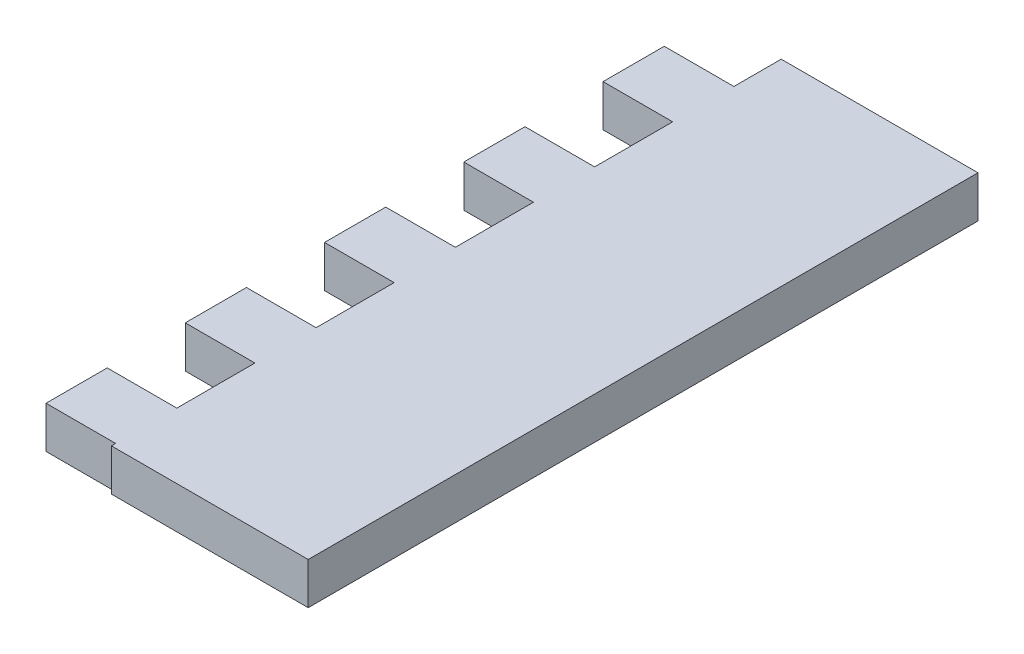
ISO-10303-21;
HEADER;
FILE_DESCRIPTION(('STEP AP214'),'2;1');
FILE_NAME('part.step','',(''),(''),'','','');
FILE_SCHEMA(('AUTOMOTIVE_DESIGN { 1 0 10303 214 1 1 1 1 }'));
ENDSEC;
DATA;
#1=APPLICATION_CONTEXT('core data for automotive mechanical design processes');
#2=APPLICATION_PROTOCOL_DEFINITION('international standard','automotive_design',2000,#1);
#3=PRODUCT_CONTEXT('',#1,'mechanical');
#4=PRODUCT('Part','Part','',(#3));
#5=PRODUCT_RELATED_PRODUCT_CATEGORY('part','',(#4));
#6=PRODUCT_DEFINITION_FORMATION('','',#4);
#7=PRODUCT_DEFINITION_CONTEXT('part definition',#1,'design');
#8=PRODUCT_DEFINITION('design','',#6,#7);
#9=PRODUCT_DEFINITION_SHAPE('','',#8);
#10=(LENGTH_UNIT() NAMED_UNIT(*) SI_UNIT(.MILLI.,.METRE.));
#11=(NAMED_UNIT(*) PLANE_ANGLE_UNIT() SI_UNIT($,.RADIAN.));
#12=(NAMED_UNIT(*) SI_UNIT($,.STERADIAN.) SOLID_ANGLE_UNIT());
#13=UNCERTAINTY_MEASURE_WITH_UNIT(LENGTH_MEASURE(1.E-05),#10,'distance_accuracy_value','');
#14=(GEOMETRIC_REPRESENTATION_CONTEXT(3) GLOBAL_UNCERTAINTY_ASSIGNED_CONTEXT((#13)) GLOBAL_UNIT_ASSIGNED_CONTEXT((#10,
#11,#12)) REPRESENTATION_CONTEXT('',''));
#15=CARTESIAN_POINT('',(0.,0.,0.));
#16=DIRECTION('',(0.,0.,1.));
#17=DIRECTION('',(1.,0.,0.));
#18=AXIS2_PLACEMENT_3D('',#15,#16,#17);
#19=CARTESIAN_POINT('',(-9.56520415000191,3.,-25.));
#20=DIRECTION('',(1.,0.,0.));
#21=DIRECTION('',(0.,0.,-1.));
#22=AXIS2_PLACEMENT_3D('',#19,#20,#21);
#23=PLANE('',#22);
#24=DIRECTION('',(0.,0.,1.));
#25=VECTOR('',#24,1.);
#26=CARTESIAN_POINT('',(-9.56520415000191,0.,-25.));
#27=LINE('',#26,#25);
#28=CARTESIAN_POINT('',(-9.56520415000191,0.,-19.6973042257871));
#29=VERTEX_POINT('',#28);
#30=CARTESIAN_POINT('',(-9.56520415000191,0.,-15.302695774213));
#31=VERTEX_POINT('',#30);
#32=EDGE_CURVE('E333',#29,#31,#27,.T.);
#33=ORIENTED_EDGE('',*,*,#32,.T.);
#34=DIRECTION('',(0.,1.,0.));
#35=VECTOR('',#34,1.);
#36=CARTESIAN_POINT('',(-9.56520415000191,-7.,-15.302695774213));
#37=LINE('',#36,#35);
#38=CARTESIAN_POINT('',(-9.56520415000191,3.,-15.302695774213));
#39=VERTEX_POINT('',#38);
#40=EDGE_CURVE('E215',#31,#39,#37,.T.);
#41=ORIENTED_EDGE('',*,*,#40,.T.);
#42=DIRECTION('',(0.,0.,1.));
#43=VECTOR('',#42,1.);
#44=CARTESIAN_POINT('',(-9.56520415000191,3.,-25.));
#45=LINE('',#44,#43);
#46=CARTESIAN_POINT('',(-9.56520415000191,3.,-19.6973042257871));
#47=VERTEX_POINT('',#46);
#48=EDGE_CURVE('E221',#47,#39,#45,.T.);
#49=ORIENTED_EDGE('',*,*,#48,.F.);
#50=DIRECTION('',(0.,1.,0.));
#51=VECTOR('',#50,1.);
#52=CARTESIAN_POINT('',(-9.56520415000191,-7.,-19.6973042257871));
#53=LINE('',#52,#51);
#54=EDGE_CURVE('E292',#29,#47,#53,.T.);
#55=ORIENTED_EDGE('',*,*,#54,.F.);
#56=EDGE_LOOP('',(#33,#41,#49,#55));
#57=FACE_BOUND('',#56,.T.);
#58=ADVANCED_FACE('F35',(#57),#23,.F.);
#59=CARTESIAN_POINT('',(-9.56520415000191,3.,-9.69730422578705));
#60=VERTEX_POINT('',#59);
#61=CARTESIAN_POINT('',(-9.56520415000191,3.,-5.30269577421296));
#62=VERTEX_POINT('',#61);
#63=EDGE_CURVE('E327',#60,#62,#45,.T.);
#64=ORIENTED_EDGE('',*,*,#63,.F.);
#65=DIRECTION('',(0.,1.,0.));
#66=VECTOR('',#65,1.);
#67=CARTESIAN_POINT('',(-9.56520415000191,-7.,-9.69730422578705));
#68=LINE('',#67,#66);
#69=CARTESIAN_POINT('',(-9.56520415000191,0.,-9.69730422578705));
#70=VERTEX_POINT('',#69);
#71=EDGE_CURVE('E223',#70,#60,#68,.T.);
#72=ORIENTED_EDGE('',*,*,#71,.F.);
#73=CARTESIAN_POINT('',(-9.56520415000191,0.,-5.30269577421296));
#74=VERTEX_POINT('',#73);
#75=EDGE_CURVE('E336',#70,#74,#27,.T.);
#76=ORIENTED_EDGE('',*,*,#75,.T.);
#77=DIRECTION('',(0.,1.,0.));
#78=VECTOR('',#77,1.);
#79=CARTESIAN_POINT('',(-9.56520415000191,-7.,-5.30269577421296));
#80=LINE('',#79,#78);
#81=EDGE_CURVE('E234',#74,#62,#80,.T.);
#82=ORIENTED_EDGE('',*,*,#81,.T.);
#83=EDGE_LOOP('',(#64,#72,#76,#82));
#84=FACE_BOUND('',#83,.T.);
#85=ADVANCED_FACE('F377',(#84),#23,.F.);
#86=CARTESIAN_POINT('',(-9.56520415000191,3.,0.302695774212949));
#87=VERTEX_POINT('',#86);
#88=CARTESIAN_POINT('',(-9.56520415000191,3.,4.69730422578704));
#89=VERTEX_POINT('',#88);
#90=EDGE_CURVE('E380',#87,#89,#45,.T.);
#91=ORIENTED_EDGE('',*,*,#90,.F.);
#92=DIRECTION('',(0.,1.,0.));
#93=VECTOR('',#92,1.);
#94=CARTESIAN_POINT('',(-9.56520415000191,-7.,0.302695774212949));
#95=LINE('',#94,#93);
#96=CARTESIAN_POINT('',(-9.56520415000191,0.,0.302695774212949));
#97=VERTEX_POINT('',#96);
#98=EDGE_CURVE('E243',#97,#87,#95,.T.);
#99=ORIENTED_EDGE('',*,*,#98,.F.);
#100=CARTESIAN_POINT('',(-9.56520415000191,0.,4.69730422578704));
#101=VERTEX_POINT('',#100);
#102=EDGE_CURVE('E680',#97,#101,#27,.T.);
#103=ORIENTED_EDGE('',*,*,#102,.T.);
#104=DIRECTION('',(0.,1.,0.));
#105=VECTOR('',#104,1.);
#106=CARTESIAN_POINT('',(-9.56520415000191,-7.,4.69730422578704));
#107=LINE('',#106,#105);
#108=EDGE_CURVE('E250',#101,#89,#107,.T.);
#109=ORIENTED_EDGE('',*,*,#108,.T.);
#110=EDGE_LOOP('',(#91,#99,#103,#109));
#111=FACE_BOUND('',#110,.T.);
#112=ADVANCED_FACE('F436',(#111),#23,.F.);
#113=CARTESIAN_POINT('',(-9.56520415000191,3.,10.3026957742129));
#114=VERTEX_POINT('',#113);
#115=CARTESIAN_POINT('',(-9.56520415000191,3.,14.697304225787));
#116=VERTEX_POINT('',#115);
#117=EDGE_CURVE('E382',#114,#116,#45,.T.);
#118=ORIENTED_EDGE('',*,*,#117,.F.);
#119=DIRECTION('',(0.,1.,0.));
#120=VECTOR('',#119,1.);
#121=CARTESIAN_POINT('',(-9.56520415000191,-7.,10.3026957742129));
#122=LINE('',#121,#120);
#123=CARTESIAN_POINT('',(-9.56520415000191,0.,10.3026957742129));
#124=VERTEX_POINT('',#123);
#125=EDGE_CURVE('E259',#124,#114,#122,.T.);
#126=ORIENTED_EDGE('',*,*,#125,.F.);
#127=CARTESIAN_POINT('',(-9.56520415000191,0.,14.697304225787));
#128=VERTEX_POINT('',#127);
#129=EDGE_CURVE('E453',#124,#128,#27,.T.);
#130=ORIENTED_EDGE('',*,*,#129,.T.);
#131=DIRECTION('',(0.,1.,0.));
#132=VECTOR('',#131,1.);
#133=CARTESIAN_POINT('',(-9.56520415000191,-7.,14.697304225787));
#134=LINE('',#133,#132);
#135=EDGE_CURVE('E266',#128,#116,#134,.T.);
#136=ORIENTED_EDGE('',*,*,#135,.T.);
#137=EDGE_LOOP('',(#118,#126,#130,#136));
#138=FACE_BOUND('',#137,.T.);
#139=ADVANCED_FACE('F439',(#138),#23,.F.);
#140=CARTESIAN_POINT('',(9.56520415000191,3.,-25.));
#141=DIRECTION('',(-1.,0.,0.));
#142=DIRECTION('',(0.,0.,1.));
#143=AXIS2_PLACEMENT_3D('',#140,#141,#142);
#144=PLANE('',#143);
#145=DIRECTION('',(0.,0.,-1.));
#146=VECTOR('',#145,1.);
#147=CARTESIAN_POINT('',(9.56520415000191,0.,-25.));
#148=LINE('',#147,#146);
#149=CARTESIAN_POINT('',(9.56520415000191,0.,25.));
#150=VERTEX_POINT('',#149);
#151=CARTESIAN_POINT('',(9.56520415000191,0.,-23.0948619852018));
#152=VERTEX_POINT('',#151);
#153=EDGE_CURVE('E318',#150,#152,#148,.T.);
#154=ORIENTED_EDGE('',*,*,#153,.T.);
#155=DIRECTION('',(0.,1.,0.));
#156=VECTOR('',#155,1.);
#157=CARTESIAN_POINT('',(9.56520415000191,3.,-23.0948619852018));
#158=LINE('',#157,#156);
#159=CARTESIAN_POINT('',(9.56520415000191,3.,-23.0948619852018));
#160=VERTEX_POINT('',#159);
#161=EDGE_CURVE('E300',#152,#160,#158,.T.);
#162=ORIENTED_EDGE('',*,*,#161,.T.);
#163=DIRECTION('',(0.,0.,-1.));
#164=VECTOR('',#163,1.);
#165=CARTESIAN_POINT('',(9.56520415000191,3.,-25.));
#166=LINE('',#165,#164);
#167=CARTESIAN_POINT('',(9.56520415000191,3.,25.));
#168=VERTEX_POINT('',#167);
#169=EDGE_CURVE('E320',#168,#160,#166,.T.);
#170=ORIENTED_EDGE('',*,*,#169,.F.);
#171=DIRECTION('',(0.,-1.,0.));
#172=VECTOR('',#171,1.);
#173=CARTESIAN_POINT('',(9.56520415000191,3.,25.));
#174=LINE('',#173,#172);
#175=EDGE_CURVE('E329',#168,#150,#174,.T.);
#176=ORIENTED_EDGE('',*,*,#175,.T.);
#177=EDGE_LOOP('',(#154,#162,#170,#176));
#178=FACE_BOUND('',#177,.T.);
#179=ADVANCED_FACE('F37',(#178),#144,.F.);
#180=CARTESIAN_POINT('',(-9.5652041500019,3.,20.3026957742129));
#181=VERTEX_POINT('',#180);
#182=CARTESIAN_POINT('',(-9.5652041500019,3.,24.697304225787));
#183=VERTEX_POINT('',#182);
#184=EDGE_CURVE('E323',#181,#183,#45,.T.);
#185=ORIENTED_EDGE('',*,*,#184,.F.);
#186=DIRECTION('',(0.,1.,0.));
#187=VECTOR('',#186,1.);
#188=CARTESIAN_POINT('',(-9.5652041500019,-7.,20.3026957742129));
#189=LINE('',#188,#187);
#190=CARTESIAN_POINT('',(-9.5652041500019,0.,20.3026957742129));
#191=VERTEX_POINT('',#190);
#192=EDGE_CURVE('E275',#191,#181,#189,.T.);
#193=ORIENTED_EDGE('',*,*,#192,.F.);
#194=CARTESIAN_POINT('',(-9.5652041500019,0.,24.697304225787));
#195=VERTEX_POINT('',#194);
#196=EDGE_CURVE('E332',#191,#195,#27,.T.);
#197=ORIENTED_EDGE('',*,*,#196,.T.);
#198=DIRECTION('',(0.,1.,0.));
#199=VECTOR('',#198,1.);
#200=CARTESIAN_POINT('',(-9.5652041500019,-7.,24.697304225787));
#201=LINE('',#200,#199);
#202=EDGE_CURVE('E283',#195,#183,#201,.T.);
#203=ORIENTED_EDGE('',*,*,#202,.T.);
#204=EDGE_LOOP('',(#185,#193,#197,#203));
#205=FACE_BOUND('',#204,.T.);
#206=ADVANCED_FACE('F397',(#205),#23,.F.);
#207=CARTESIAN_POINT('',(-9.56520415000191,3.,25.));
#208=DIRECTION('',(0.,0.,-1.));
#209=DIRECTION('',(-1.,0.,0.));
#210=AXIS2_PLACEMENT_3D('',#207,#208,#209);
#211=PLANE('',#210);
#212=DIRECTION('',(1.,0.,0.));
#213=VECTOR('',#212,1.);
#214=CARTESIAN_POINT('',(-9.56520415000191,3.,25.));
#215=LINE('',#214,#213);
#216=CARTESIAN_POINT('',(-4.5652041500019,3.,25.));
#217=VERTEX_POINT('',#216);
#218=EDGE_CURVE('E326',#217,#168,#215,.T.);
#219=ORIENTED_EDGE('',*,*,#218,.F.);
#220=DIRECTION('',(0.,-1.,0.));
#221=VECTOR('',#220,1.);
#222=CARTESIAN_POINT('',(-4.5652041500019,3.,25.));
#223=LINE('',#222,#221);
#224=CARTESIAN_POINT('',(-4.5652041500019,0.,25.));
#225=VERTEX_POINT('',#224);
#226=EDGE_CURVE('E226',#217,#225,#223,.T.);
#227=ORIENTED_EDGE('',*,*,#226,.T.);
#228=DIRECTION('',(1.,0.,0.));
#229=VECTOR('',#228,1.);
#230=CARTESIAN_POINT('',(-9.56520415000191,0.,25.));
#231=LINE('',#230,#229);
#232=EDGE_CURVE('E324',#225,#150,#231,.T.);
#233=ORIENTED_EDGE('',*,*,#232,.T.);
#234=ORIENTED_EDGE('',*,*,#175,.F.);
#235=EDGE_LOOP('',(#219,#227,#233,#234));
#236=FACE_BOUND('',#235,.T.);
#237=ADVANCED_FACE('F407',(#236),#211,.F.);
#238=CARTESIAN_POINT('',(0.,3.,0.));
#239=DIRECTION('',(0.,1.,0.));
#240=DIRECTION('',(0.,0.,1.));
#241=AXIS2_PLACEMENT_3D('',#238,#239,#240);
#242=PLANE('',#241);
#243=DIRECTION('',(-1.,0.,0.));
#244=VECTOR('',#243,1.);
#245=CARTESIAN_POINT('',(-9.56520415000191,3.,-15.302695774213));
#246=LINE('',#245,#244);
#247=CARTESIAN_POINT('',(-4.56520415000191,3.,-15.302695774213));
#248=VERTEX_POINT('',#247);
#249=EDGE_CURVE('E213',#248,#39,#246,.T.);
#250=ORIENTED_EDGE('',*,*,#249,.F.);
#251=DIRECTION('',(0.,0.,-1.));
#252=VECTOR('',#251,1.);
#253=CARTESIAN_POINT('',(-4.56520415000191,3.,-15.));
#254=LINE('',#253,#252);
#255=CARTESIAN_POINT('',(-4.56520415000191,3.,-9.69730422578705));
#256=VERTEX_POINT('',#255);
#257=EDGE_CURVE('E197',#256,#248,#254,.T.);
#258=ORIENTED_EDGE('',*,*,#257,.F.);
#259=DIRECTION('',(1.,0.,0.));
#260=VECTOR('',#259,1.);
#261=CARTESIAN_POINT('',(-9.56520415000191,3.,-9.69730422578705));
#262=LINE('',#261,#260);
#263=EDGE_CURVE('E228',#60,#256,#262,.T.);
#264=ORIENTED_EDGE('',*,*,#263,.F.);
#265=ORIENTED_EDGE('',*,*,#63,.T.);
#266=DIRECTION('',(-1.,0.,0.));
#267=VECTOR('',#266,1.);
#268=CARTESIAN_POINT('',(-9.56520415000191,3.,-5.30269577421296));
#269=LINE('',#268,#267);
#270=CARTESIAN_POINT('',(-4.56520415000191,3.,-5.30269577421296));
#271=VERTEX_POINT('',#270);
#272=EDGE_CURVE('E232',#271,#62,#269,.T.);
#273=ORIENTED_EDGE('',*,*,#272,.F.);
#274=DIRECTION('',(0.,0.,-1.));
#275=VECTOR('',#274,1.);
#276=CARTESIAN_POINT('',(-4.56520415000191,3.,-5.));
#277=LINE('',#276,#275);
#278=CARTESIAN_POINT('',(-4.56520415000191,3.,0.302695774212949));
#279=VERTEX_POINT('',#278);
#280=EDGE_CURVE('E308',#279,#271,#277,.T.);
#281=ORIENTED_EDGE('',*,*,#280,.F.);
#282=DIRECTION('',(1.,0.,0.));
#283=VECTOR('',#282,1.);
#284=CARTESIAN_POINT('',(-9.56520415000191,3.,0.302695774212949));
#285=LINE('',#284,#283);
#286=EDGE_CURVE('E240',#87,#279,#285,.T.);
#287=ORIENTED_EDGE('',*,*,#286,.F.);
#288=ORIENTED_EDGE('',*,*,#90,.T.);
#289=DIRECTION('',(-1.,0.,0.));
#290=VECTOR('',#289,1.);
#291=CARTESIAN_POINT('',(-9.56520415000191,3.,4.69730422578704));
#292=LINE('',#291,#290);
#293=CARTESIAN_POINT('',(-4.56520415000191,3.,4.69730422578704));
#294=VERTEX_POINT('',#293);
#295=EDGE_CURVE('E248',#294,#89,#292,.T.);
#296=ORIENTED_EDGE('',*,*,#295,.F.);
#297=DIRECTION('',(0.,0.,-1.));
#298=VECTOR('',#297,1.);
#299=CARTESIAN_POINT('',(-4.56520415000191,3.,4.99999999999999));
#300=LINE('',#299,#298);
#301=CARTESIAN_POINT('',(-4.5652041500019,3.,10.3026957742129));
#302=VERTEX_POINT('',#301);
#303=EDGE_CURVE('E312',#302,#294,#300,.T.);
#304=ORIENTED_EDGE('',*,*,#303,.F.);
#305=DIRECTION('',(1.,0.,0.));
#306=VECTOR('',#305,1.);
#307=CARTESIAN_POINT('',(-9.56520415000191,3.,10.3026957742129));
#308=LINE('',#307,#306);
#309=EDGE_CURVE('E256',#114,#302,#308,.T.);
#310=ORIENTED_EDGE('',*,*,#309,.F.);
#311=ORIENTED_EDGE('',*,*,#117,.T.);
#312=DIRECTION('',(-1.,0.,0.));
#313=VECTOR('',#312,1.);
#314=CARTESIAN_POINT('',(-9.56520415000191,3.,14.697304225787));
#315=LINE('',#314,#313);
#316=CARTESIAN_POINT('',(-4.5652041500019,3.,14.697304225787));
#317=VERTEX_POINT('',#316);
#318=EDGE_CURVE('E264',#317,#116,#315,.T.);
#319=ORIENTED_EDGE('',*,*,#318,.F.);
#320=DIRECTION('',(0.,0.,-1.));
#321=VECTOR('',#320,1.);
#322=CARTESIAN_POINT('',(-4.56520415000191,3.,15.));
#323=LINE('',#322,#321);
#324=CARTESIAN_POINT('',(-4.5652041500019,3.,20.3026957742129));
#325=VERTEX_POINT('',#324);
#326=EDGE_CURVE('E304',#325,#317,#323,.T.);
#327=ORIENTED_EDGE('',*,*,#326,.F.);
#328=DIRECTION('',(1.,0.,0.));
#329=VECTOR('',#328,1.);
#330=CARTESIAN_POINT('',(-9.5652041500019,3.,20.3026957742129));
#331=LINE('',#330,#329);
#332=EDGE_CURVE('E272',#181,#325,#331,.T.);
#333=ORIENTED_EDGE('',*,*,#332,.F.);
#334=ORIENTED_EDGE('',*,*,#184,.T.);
#335=DIRECTION('',(-1.,0.,0.));
#336=VECTOR('',#335,1.);
#337=CARTESIAN_POINT('',(-9.5652041500019,3.,24.697304225787));
#338=LINE('',#337,#336);
#339=CARTESIAN_POINT('',(-4.5652041500019,3.,24.697304225787));
#340=VERTEX_POINT('',#339);
#341=EDGE_CURVE('E279',#340,#183,#338,.T.);
#342=ORIENTED_EDGE('',*,*,#341,.F.);
#343=DIRECTION('',(0.,0.,-1.));
#344=VECTOR('',#343,1.);
#345=CARTESIAN_POINT('',(-4.5652041500019,3.,25.3026957742129));
#346=LINE('',#345,#344);
#347=EDGE_CURVE('E281',#217,#340,#346,.T.);
#348=ORIENTED_EDGE('',*,*,#347,.F.);
#349=ORIENTED_EDGE('',*,*,#218,.T.);
#350=ORIENTED_EDGE('',*,*,#169,.T.);
#351=DIRECTION('',(1.,0.,0.));
#352=VECTOR('',#351,1.);
#353=CARTESIAN_POINT('',(-6.02355894296541,3.,-23.0948619852018));
#354=LINE('',#353,#352);
#355=CARTESIAN_POINT('',(-4.56520415000191,3.,-23.0948619852018));
#356=VERTEX_POINT('',#355);
#357=EDGE_CURVE('E296',#356,#160,#354,.T.);
#358=ORIENTED_EDGE('',*,*,#357,.F.);
#359=DIRECTION('',(0.,0.,-1.));
#360=VECTOR('',#359,1.);
#361=CARTESIAN_POINT('',(-4.56520415000191,3.,-25.));
#362=LINE('',#361,#360);
#363=CARTESIAN_POINT('',(-4.56520415000191,3.,-19.6973042257871));
#364=VERTEX_POINT('',#363);
#365=EDGE_CURVE('E305',#364,#356,#362,.T.);
#366=ORIENTED_EDGE('',*,*,#365,.F.);
#367=DIRECTION('',(1.,0.,0.));
#368=VECTOR('',#367,1.);
#369=CARTESIAN_POINT('',(-9.56520415000191,3.,-19.6973042257871));
#370=LINE('',#369,#368);
#371=EDGE_CURVE('E289',#47,#364,#370,.T.);
#372=ORIENTED_EDGE('',*,*,#371,.F.);
#373=ORIENTED_EDGE('',*,*,#48,.T.);
#374=EDGE_LOOP('',(#250,#258,#264,#265,#273,#281,#287,#288,#296,#304,#310,#311,#319,#327,#333,
#334,#342,#348,#349,#350,#358,#366,#372,#373));
#375=FACE_BOUND('',#374,.T.);
#376=ADVANCED_FACE('F218',(#375),#242,.T.);
#377=CARTESIAN_POINT('',(0.,0.,0.));
#378=DIRECTION('',(0.,1.,0.));
#379=DIRECTION('',(0.,0.,1.));
#380=AXIS2_PLACEMENT_3D('',#377,#378,#379);
#381=PLANE('',#380);
#382=DIRECTION('',(0.,0.,-1.));
#383=VECTOR('',#382,1.);
#384=CARTESIAN_POINT('',(-4.56520415000191,0.,-15.));
#385=LINE('',#384,#383);
#386=CARTESIAN_POINT('',(-4.56520415000191,0.,-9.69730422578705));
#387=VERTEX_POINT('',#386);
#388=CARTESIAN_POINT('',(-4.56520415000191,0.,-15.302695774213));
#389=VERTEX_POINT('',#388);
#390=EDGE_CURVE('E207',#387,#389,#385,.T.);
#391=ORIENTED_EDGE('',*,*,#390,.T.);
#392=DIRECTION('',(-1.,0.,0.));
#393=VECTOR('',#392,1.);
#394=CARTESIAN_POINT('',(0.,0.,-15.302695774213));
#395=LINE('',#394,#393);
#396=EDGE_CURVE('E11',#389,#31,#395,.T.);
#397=ORIENTED_EDGE('',*,*,#396,.T.);
#398=ORIENTED_EDGE('',*,*,#32,.F.);
#399=DIRECTION('',(1.,0.,0.));
#400=VECTOR('',#399,1.);
#401=CARTESIAN_POINT('',(0.,0.,-19.6973042257871));
#402=LINE('',#401,#400);
#403=CARTESIAN_POINT('',(-4.56520415000191,0.,-19.6973042257871));
#404=VERTEX_POINT('',#403);
#405=EDGE_CURVE('E343',#29,#404,#402,.T.);
#406=ORIENTED_EDGE('',*,*,#405,.T.);
#407=DIRECTION('',(0.,0.,-1.));
#408=VECTOR('',#407,1.);
#409=CARTESIAN_POINT('',(-4.56520415000191,0.,-25.));
#410=LINE('',#409,#408);
#411=CARTESIAN_POINT('',(-4.56520415000191,0.,-23.0948619852018));
#412=VERTEX_POINT('',#411);
#413=EDGE_CURVE('E58',#404,#412,#410,.T.);
#414=ORIENTED_EDGE('',*,*,#413,.T.);
#415=DIRECTION('',(1.,0.,0.));
#416=VECTOR('',#415,1.);
#417=CARTESIAN_POINT('',(-6.02355894296541,0.,-23.0948619852018));
#418=LINE('',#417,#416);
#419=EDGE_CURVE('E298',#412,#152,#418,.T.);
#420=ORIENTED_EDGE('',*,*,#419,.T.);
#421=ORIENTED_EDGE('',*,*,#153,.F.);
#422=ORIENTED_EDGE('',*,*,#232,.F.);
#423=DIRECTION('',(0.,0.,-1.));
#424=VECTOR('',#423,1.);
#425=CARTESIAN_POINT('',(-4.5652041500019,0.,0.));
#426=LINE('',#425,#424);
#427=CARTESIAN_POINT('',(-4.5652041500019,0.,24.697304225787));
#428=VERTEX_POINT('',#427);
#429=EDGE_CURVE('E345',#225,#428,#426,.T.);
#430=ORIENTED_EDGE('',*,*,#429,.T.);
#431=DIRECTION('',(-1.,0.,0.));
#432=VECTOR('',#431,1.);
#433=CARTESIAN_POINT('',(0.,0.,24.697304225787));
#434=LINE('',#433,#432);
#435=EDGE_CURVE('E348',#428,#195,#434,.T.);
#436=ORIENTED_EDGE('',*,*,#435,.T.);
#437=ORIENTED_EDGE('',*,*,#196,.F.);
#438=DIRECTION('',(1.,0.,0.));
#439=VECTOR('',#438,1.);
#440=CARTESIAN_POINT('',(0.,0.,20.3026957742129));
#441=LINE('',#440,#439);
#442=CARTESIAN_POINT('',(-4.5652041500019,0.,20.3026957742129));
#443=VERTEX_POINT('',#442);
#444=EDGE_CURVE('E351',#191,#443,#441,.T.);
#445=ORIENTED_EDGE('',*,*,#444,.T.);
#446=DIRECTION('',(0.,0.,-1.));
#447=VECTOR('',#446,1.);
#448=CARTESIAN_POINT('',(-4.56520415000191,0.,15.));
#449=LINE('',#448,#447);
#450=CARTESIAN_POINT('',(-4.5652041500019,0.,14.697304225787));
#451=VERTEX_POINT('',#450);
#452=EDGE_CURVE('E314',#443,#451,#449,.T.);
#453=ORIENTED_EDGE('',*,*,#452,.T.);
#454=DIRECTION('',(-1.,0.,0.));
#455=VECTOR('',#454,1.);
#456=CARTESIAN_POINT('',(0.,0.,14.697304225787));
#457=LINE('',#456,#455);
#458=EDGE_CURVE('E354',#451,#128,#457,.T.);
#459=ORIENTED_EDGE('',*,*,#458,.T.);
#460=ORIENTED_EDGE('',*,*,#129,.F.);
#461=DIRECTION('',(1.,0.,0.));
#462=VECTOR('',#461,1.);
#463=CARTESIAN_POINT('',(0.,0.,10.3026957742129));
#464=LINE('',#463,#462);
#465=CARTESIAN_POINT('',(-4.5652041500019,0.,10.3026957742129));
#466=VERTEX_POINT('',#465);
#467=EDGE_CURVE('E357',#124,#466,#464,.T.);
#468=ORIENTED_EDGE('',*,*,#467,.T.);
#469=DIRECTION('',(0.,0.,-1.));
#470=VECTOR('',#469,1.);
#471=CARTESIAN_POINT('',(-4.56520415000191,0.,4.99999999999999));
#472=LINE('',#471,#470);
#473=CARTESIAN_POINT('',(-4.56520415000191,0.,4.69730422578704));
#474=VERTEX_POINT('',#473);
#475=EDGE_CURVE('E310',#466,#474,#472,.T.);
#476=ORIENTED_EDGE('',*,*,#475,.T.);
#477=DIRECTION('',(-1.,0.,0.));
#478=VECTOR('',#477,1.);
#479=CARTESIAN_POINT('',(0.,0.,4.69730422578704));
#480=LINE('',#479,#478);
#481=EDGE_CURVE('E360',#474,#101,#480,.T.);
#482=ORIENTED_EDGE('',*,*,#481,.T.);
#483=ORIENTED_EDGE('',*,*,#102,.F.);
#484=DIRECTION('',(1.,0.,0.));
#485=VECTOR('',#484,1.);
#486=CARTESIAN_POINT('',(0.,0.,0.302695774212949));
#487=LINE('',#486,#485);
#488=CARTESIAN_POINT('',(-4.56520415000191,0.,0.302695774212949));
#489=VERTEX_POINT('',#488);
#490=EDGE_CURVE('E363',#97,#489,#487,.T.);
#491=ORIENTED_EDGE('',*,*,#490,.T.);
#492=DIRECTION('',(0.,0.,-1.));
#493=VECTOR('',#492,1.);
#494=CARTESIAN_POINT('',(-4.56520415000191,0.,-5.));
#495=LINE('',#494,#493);
#496=CARTESIAN_POINT('',(-4.56520415000191,0.,-5.30269577421296));
#497=VERTEX_POINT('',#496);
#498=EDGE_CURVE('E208',#489,#497,#495,.T.);
#499=ORIENTED_EDGE('',*,*,#498,.T.);
#500=DIRECTION('',(-1.,0.,0.));
#501=VECTOR('',#500,1.);
#502=CARTESIAN_POINT('',(0.,0.,-5.30269577421296));
#503=LINE('',#502,#501);
#504=EDGE_CURVE('E366',#497,#74,#503,.T.);
#505=ORIENTED_EDGE('',*,*,#504,.T.);
#506=ORIENTED_EDGE('',*,*,#75,.F.);
#507=DIRECTION('',(1.,0.,0.));
#508=VECTOR('',#507,1.);
#509=CARTESIAN_POINT('',(0.,0.,-9.69730422578705));
#510=LINE('',#509,#508);
#511=EDGE_CURVE('E43',#70,#387,#510,.T.);
#512=ORIENTED_EDGE('',*,*,#511,.T.);
#513=EDGE_LOOP('',(#391,#397,#398,#406,#414,#420,#421,#422,#430,#436,#437,#445,#453,#459,#460,
#468,#476,#482,#483,#491,#499,#505,#506,#512));
#514=FACE_BOUND('',#513,.T.);
#515=ADVANCED_FACE('F370',(#514),#381,.F.);
#516=CARTESIAN_POINT('',(-4.56520415000191,0.,-25.));
#517=DIRECTION('',(1.,0.,0.));
#518=DIRECTION('',(0.,0.,-1.));
#519=AXIS2_PLACEMENT_3D('',#516,#517,#518);
#520=PLANE('',#519);
#521=DIRECTION('',(0.,-1.,0.));
#522=VECTOR('',#521,1.);
#523=CARTESIAN_POINT('',(-4.56520415000191,0.,-23.0948619852018));
#524=LINE('',#523,#522);
#525=EDGE_CURVE('E340',#356,#412,#524,.T.);
#526=ORIENTED_EDGE('',*,*,#525,.T.);
#527=ORIENTED_EDGE('',*,*,#413,.F.);
#528=DIRECTION('',(0.,1.,0.));
#529=VECTOR('',#528,1.);
#530=CARTESIAN_POINT('',(-4.56520415000191,-7.,-19.6973042257871));
#531=LINE('',#530,#529);
#532=EDGE_CURVE('E293',#404,#364,#531,.T.);
#533=ORIENTED_EDGE('',*,*,#532,.T.);
#534=ORIENTED_EDGE('',*,*,#365,.T.);
#535=EDGE_LOOP('',(#526,#527,#533,#534));
#536=FACE_BOUND('',#535,.T.);
#537=ADVANCED_FACE('F416',(#536),#520,.F.);
#538=CARTESIAN_POINT('',(-4.56520415000191,0.,15.));
#539=DIRECTION('',(1.,0.,0.));
#540=DIRECTION('',(0.,0.,-1.));
#541=AXIS2_PLACEMENT_3D('',#538,#539,#540);
#542=PLANE('',#541);
#543=ORIENTED_EDGE('',*,*,#326,.T.);
#544=DIRECTION('',(0.,1.,0.));
#545=VECTOR('',#544,1.);
#546=CARTESIAN_POINT('',(-4.5652041500019,-7.,14.697304225787));
#547=LINE('',#546,#545);
#548=EDGE_CURVE('E260',#451,#317,#547,.T.);
#549=ORIENTED_EDGE('',*,*,#548,.F.);
#550=ORIENTED_EDGE('',*,*,#452,.F.);
#551=DIRECTION('',(0.,1.,0.));
#552=VECTOR('',#551,1.);
#553=CARTESIAN_POINT('',(-4.5652041500019,-7.,20.3026957742129));
#554=LINE('',#553,#552);
#555=EDGE_CURVE('E267',#443,#325,#554,.T.);
#556=ORIENTED_EDGE('',*,*,#555,.T.);
#557=EDGE_LOOP('',(#543,#549,#550,#556));
#558=FACE_BOUND('',#557,.T.);
#559=ADVANCED_FACE('F460',(#558),#542,.F.);
#560=CARTESIAN_POINT('',(-4.56520415000191,0.,4.99999999999999));
#561=DIRECTION('',(1.,0.,0.));
#562=DIRECTION('',(0.,0.,-1.));
#563=AXIS2_PLACEMENT_3D('',#560,#561,#562);
#564=PLANE('',#563);
#565=ORIENTED_EDGE('',*,*,#303,.T.);
#566=DIRECTION('',(0.,1.,0.));
#567=VECTOR('',#566,1.);
#568=CARTESIAN_POINT('',(-4.56520415000191,-7.,4.69730422578704));
#569=LINE('',#568,#567);
#570=EDGE_CURVE('E244',#474,#294,#569,.T.);
#571=ORIENTED_EDGE('',*,*,#570,.F.);
#572=ORIENTED_EDGE('',*,*,#475,.F.);
#573=DIRECTION('',(0.,1.,0.));
#574=VECTOR('',#573,1.);
#575=CARTESIAN_POINT('',(-4.5652041500019,-7.,10.3026957742129));
#576=LINE('',#575,#574);
#577=EDGE_CURVE('E251',#466,#302,#576,.T.);
#578=ORIENTED_EDGE('',*,*,#577,.T.);
#579=EDGE_LOOP('',(#565,#571,#572,#578));
#580=FACE_BOUND('',#579,.T.);
#581=ADVANCED_FACE('F564',(#580),#564,.F.);
#582=CARTESIAN_POINT('',(-4.56520415000191,0.,-5.));
#583=DIRECTION('',(1.,0.,0.));
#584=DIRECTION('',(0.,0.,-1.));
#585=AXIS2_PLACEMENT_3D('',#582,#583,#584);
#586=PLANE('',#585);
#587=ORIENTED_EDGE('',*,*,#280,.T.);
#588=DIRECTION('',(0.,1.,0.));
#589=VECTOR('',#588,1.);
#590=CARTESIAN_POINT('',(-4.56520415000191,-7.,-5.30269577421296));
#591=LINE('',#590,#589);
#592=EDGE_CURVE('E229',#497,#271,#591,.T.);
#593=ORIENTED_EDGE('',*,*,#592,.F.);
#594=ORIENTED_EDGE('',*,*,#498,.F.);
#595=DIRECTION('',(0.,1.,0.));
#596=VECTOR('',#595,1.);
#597=CARTESIAN_POINT('',(-4.56520415000191,-7.,0.302695774212949));
#598=LINE('',#597,#596);
#599=EDGE_CURVE('E235',#489,#279,#598,.T.);
#600=ORIENTED_EDGE('',*,*,#599,.T.);
#601=EDGE_LOOP('',(#587,#593,#594,#600));
#602=FACE_BOUND('',#601,.T.);
#603=ADVANCED_FACE('F552',(#602),#586,.F.);
#604=CARTESIAN_POINT('',(-4.56520415000191,0.,-15.));
#605=DIRECTION('',(1.,0.,0.));
#606=DIRECTION('',(0.,0.,-1.));
#607=AXIS2_PLACEMENT_3D('',#604,#605,#606);
#608=PLANE('',#607);
#609=ORIENTED_EDGE('',*,*,#257,.T.);
#610=DIRECTION('',(0.,1.,0.));
#611=VECTOR('',#610,1.);
#612=CARTESIAN_POINT('',(-4.56520415000191,-7.,-15.302695774213));
#613=LINE('',#612,#611);
#614=EDGE_CURVE('E200',#389,#248,#613,.T.);
#615=ORIENTED_EDGE('',*,*,#614,.F.);
#616=ORIENTED_EDGE('',*,*,#390,.F.);
#617=DIRECTION('',(0.,1.,0.));
#618=VECTOR('',#617,1.);
#619=CARTESIAN_POINT('',(-4.56520415000191,-7.,-9.69730422578705));
#620=LINE('',#619,#618);
#621=EDGE_CURVE('E202',#387,#256,#620,.T.);
#622=ORIENTED_EDGE('',*,*,#621,.T.);
#623=EDGE_LOOP('',(#609,#615,#616,#622));
#624=FACE_BOUND('',#623,.T.);
#625=ADVANCED_FACE('F199',(#624),#608,.F.);
#626=CARTESIAN_POINT('',(-6.02355894296541,0.,-23.0948619852018));
#627=DIRECTION('',(0.,0.,1.));
#628=DIRECTION('',(1.,0.,0.));
#629=AXIS2_PLACEMENT_3D('',#626,#627,#628);
#630=PLANE('',#629);
#631=ORIENTED_EDGE('',*,*,#419,.F.);
#632=ORIENTED_EDGE('',*,*,#525,.F.);
#633=ORIENTED_EDGE('',*,*,#357,.T.);
#634=ORIENTED_EDGE('',*,*,#161,.F.);
#635=EDGE_LOOP('',(#631,#632,#633,#634));
#636=FACE_BOUND('',#635,.T.);
#637=ADVANCED_FACE('F413',(#636),#630,.F.);
#638=CARTESIAN_POINT('',(-9.56520415000191,-7.,-19.6973042257871));
#639=DIRECTION('',(0.,0.,1.));
#640=DIRECTION('',(1.,0.,0.));
#641=AXIS2_PLACEMENT_3D('',#638,#639,#640);
#642=PLANE('',#641);
#643=ORIENTED_EDGE('',*,*,#54,.T.);
#644=ORIENTED_EDGE('',*,*,#371,.T.);
#645=ORIENTED_EDGE('',*,*,#532,.F.);
#646=ORIENTED_EDGE('',*,*,#405,.F.);
#647=EDGE_LOOP('',(#643,#644,#645,#646));
#648=FACE_BOUND('',#647,.T.);
#649=ADVANCED_FACE('F422',(#648),#642,.F.);
#650=CARTESIAN_POINT('',(-9.56520415000191,-7.,-9.69730422578705));
#651=DIRECTION('',(0.,0.,1.));
#652=DIRECTION('',(1.,0.,0.));
#653=AXIS2_PLACEMENT_3D('',#650,#651,#652);
#654=PLANE('',#653);
#655=ORIENTED_EDGE('',*,*,#71,.T.);
#656=ORIENTED_EDGE('',*,*,#263,.T.);
#657=ORIENTED_EDGE('',*,*,#621,.F.);
#658=ORIENTED_EDGE('',*,*,#511,.F.);
#659=EDGE_LOOP('',(#655,#656,#657,#658));
#660=FACE_BOUND('',#659,.T.);
#661=ADVANCED_FACE('F374',(#660),#654,.F.);
#662=CARTESIAN_POINT('',(-9.56520415000191,-7.,-15.302695774213));
#663=DIRECTION('',(0.,0.,-1.));
#664=DIRECTION('',(-1.,0.,0.));
#665=AXIS2_PLACEMENT_3D('',#662,#663,#664);
#666=PLANE('',#665);
#667=ORIENTED_EDGE('',*,*,#614,.T.);
#668=ORIENTED_EDGE('',*,*,#249,.T.);
#669=ORIENTED_EDGE('',*,*,#40,.F.);
#670=ORIENTED_EDGE('',*,*,#396,.F.);
#671=EDGE_LOOP('',(#667,#668,#669,#670));
#672=FACE_BOUND('',#671,.T.);
#673=ADVANCED_FACE('F212',(#672),#666,.F.);
#674=CARTESIAN_POINT('',(-9.56520415000191,-7.,0.302695774212949));
#675=DIRECTION('',(0.,0.,1.));
#676=DIRECTION('',(1.,0.,0.));
#677=AXIS2_PLACEMENT_3D('',#674,#675,#676);
#678=PLANE('',#677);
#679=ORIENTED_EDGE('',*,*,#98,.T.);
#680=ORIENTED_EDGE('',*,*,#286,.T.);
#681=ORIENTED_EDGE('',*,*,#599,.F.);
#682=ORIENTED_EDGE('',*,*,#490,.F.);
#683=EDGE_LOOP('',(#679,#680,#681,#682));
#684=FACE_BOUND('',#683,.T.);
#685=ADVANCED_FACE('F519',(#684),#678,.F.);
#686=CARTESIAN_POINT('',(-9.56520415000191,-7.,-5.30269577421296));
#687=DIRECTION('',(0.,0.,-1.));
#688=DIRECTION('',(-1.,0.,0.));
#689=AXIS2_PLACEMENT_3D('',#686,#687,#688);
#690=PLANE('',#689);
#691=ORIENTED_EDGE('',*,*,#592,.T.);
#692=ORIENTED_EDGE('',*,*,#272,.T.);
#693=ORIENTED_EDGE('',*,*,#81,.F.);
#694=ORIENTED_EDGE('',*,*,#504,.F.);
#695=EDGE_LOOP('',(#691,#692,#693,#694));
#696=FACE_BOUND('',#695,.T.);
#697=ADVANCED_FACE('F511',(#696),#690,.F.);
#698=CARTESIAN_POINT('',(-9.56520415000191,-7.,10.3026957742129));
#699=DIRECTION('',(0.,0.,1.));
#700=DIRECTION('',(1.,0.,0.));
#701=AXIS2_PLACEMENT_3D('',#698,#699,#700);
#702=PLANE('',#701);
#703=ORIENTED_EDGE('',*,*,#125,.T.);
#704=ORIENTED_EDGE('',*,*,#309,.T.);
#705=ORIENTED_EDGE('',*,*,#577,.F.);
#706=ORIENTED_EDGE('',*,*,#467,.F.);
#707=EDGE_LOOP('',(#703,#704,#705,#706));
#708=FACE_BOUND('',#707,.T.);
#709=ADVANCED_FACE('F471',(#708),#702,.F.);
#710=CARTESIAN_POINT('',(-9.56520415000191,-7.,4.69730422578704));
#711=DIRECTION('',(0.,0.,-1.));
#712=DIRECTION('',(-1.,0.,0.));
#713=AXIS2_PLACEMENT_3D('',#710,#711,#712);
#714=PLANE('',#713);
#715=ORIENTED_EDGE('',*,*,#570,.T.);
#716=ORIENTED_EDGE('',*,*,#295,.T.);
#717=ORIENTED_EDGE('',*,*,#108,.F.);
#718=ORIENTED_EDGE('',*,*,#481,.F.);
#719=EDGE_LOOP('',(#715,#716,#717,#718));
#720=FACE_BOUND('',#719,.T.);
#721=ADVANCED_FACE('F464',(#720),#714,.F.);
#722=CARTESIAN_POINT('',(-9.5652041500019,-7.,20.3026957742129));
#723=DIRECTION('',(0.,0.,1.));
#724=DIRECTION('',(1.,0.,0.));
#725=AXIS2_PLACEMENT_3D('',#722,#723,#724);
#726=PLANE('',#725);
#727=ORIENTED_EDGE('',*,*,#192,.T.);
#728=ORIENTED_EDGE('',*,*,#332,.T.);
#729=ORIENTED_EDGE('',*,*,#555,.F.);
#730=ORIENTED_EDGE('',*,*,#444,.F.);
#731=EDGE_LOOP('',(#727,#728,#729,#730));
#732=FACE_BOUND('',#731,.T.);
#733=ADVANCED_FACE('F462',(#732),#726,.F.);
#734=CARTESIAN_POINT('',(-9.56520415000191,-7.,14.697304225787));
#735=DIRECTION('',(0.,0.,-1.));
#736=DIRECTION('',(-1.,0.,0.));
#737=AXIS2_PLACEMENT_3D('',#734,#735,#736);
#738=PLANE('',#737);
#739=ORIENTED_EDGE('',*,*,#548,.T.);
#740=ORIENTED_EDGE('',*,*,#318,.T.);
#741=ORIENTED_EDGE('',*,*,#135,.F.);
#742=ORIENTED_EDGE('',*,*,#458,.F.);
#743=EDGE_LOOP('',(#739,#740,#741,#742));
#744=FACE_BOUND('',#743,.T.);
#745=ADVANCED_FACE('F456',(#744),#738,.F.);
#746=CARTESIAN_POINT('',(-9.5652041500019,-7.,24.697304225787));
#747=DIRECTION('',(0.,0.,-1.));
#748=DIRECTION('',(-1.,0.,0.));
#749=AXIS2_PLACEMENT_3D('',#746,#747,#748);
#750=PLANE('',#749);
#751=DIRECTION('',(0.,1.,0.));
#752=VECTOR('',#751,1.);
#753=CARTESIAN_POINT('',(-4.5652041500019,-7.,24.697304225787));
#754=LINE('',#753,#752);
#755=EDGE_CURVE('E50',#428,#340,#754,.T.);
#756=ORIENTED_EDGE('',*,*,#755,.T.);
#757=ORIENTED_EDGE('',*,*,#341,.T.);
#758=ORIENTED_EDGE('',*,*,#202,.F.);
#759=ORIENTED_EDGE('',*,*,#435,.F.);
#760=EDGE_LOOP('',(#756,#757,#758,#759));
#761=FACE_BOUND('',#760,.T.);
#762=ADVANCED_FACE('F401',(#761),#750,.F.);
#763=CARTESIAN_POINT('',(-4.5652041500019,-7.,25.3026957742129));
#764=DIRECTION('',(1.,0.,0.));
#765=DIRECTION('',(0.,0.,-1.));
#766=AXIS2_PLACEMENT_3D('',#763,#764,#765);
#767=PLANE('',#766);
#768=ORIENTED_EDGE('',*,*,#347,.T.);
#769=ORIENTED_EDGE('',*,*,#755,.F.);
#770=ORIENTED_EDGE('',*,*,#429,.F.);
#771=ORIENTED_EDGE('',*,*,#226,.F.);
#772=EDGE_LOOP('',(#768,#769,#770,#771));
#773=FACE_BOUND('',#772,.T.);
#774=ADVANCED_FACE('F404',(#773),#767,.F.);
#775=CLOSED_SHELL('',(#58,#85,#112,#139,#179,#206,#237,#376,#515,#537,#559,#581,#603,#625,#637,
#649,#661,#673,#685,#697,#709,#721,#733,#745,#762,#774));
#776=MANIFOLD_SOLID_BREP('B2',#775);
#777=ADVANCED_BREP_SHAPE_REPRESENTATION('',(#18,#776),#14);
#778=SHAPE_DEFINITION_REPRESENTATION(#9,#777);
ENDSEC;
END-ISO-10303-21;
